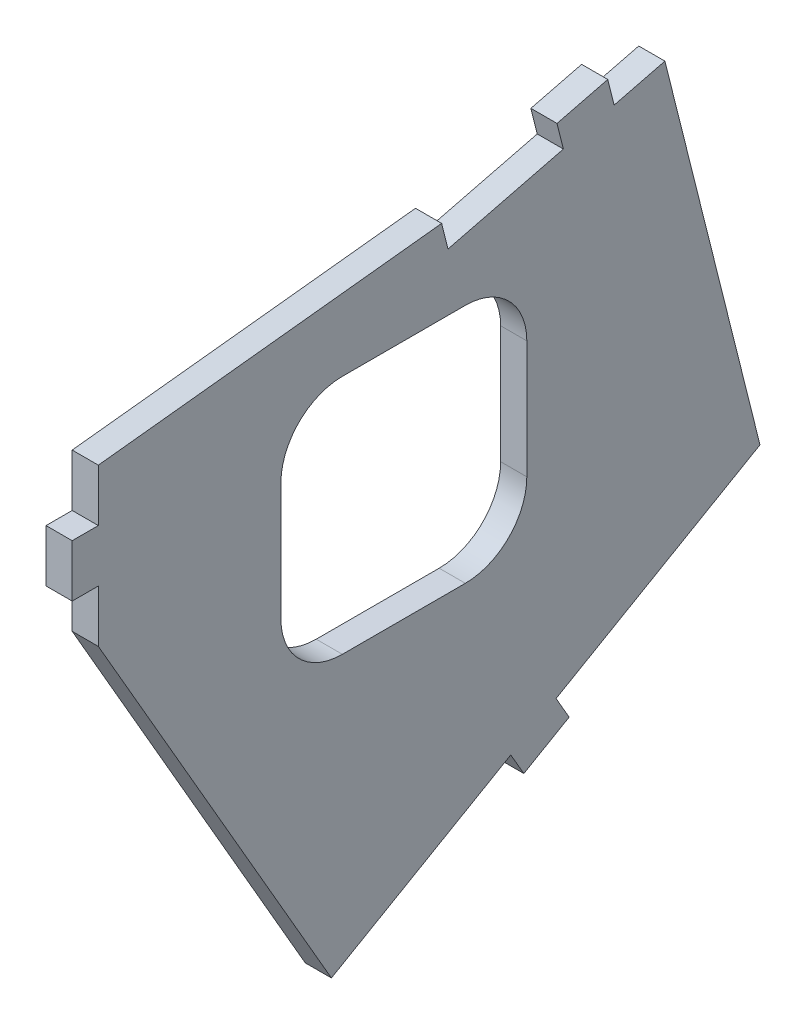
ISO-10303-21;
HEADER;
FILE_DESCRIPTION(('STEP AP214'),'2;1');
FILE_NAME('part.step','',(''),(''),'','','');
FILE_SCHEMA(('AUTOMOTIVE_DESIGN { 1 0 10303 214 1 1 1 1 }'));
ENDSEC;
DATA;
#1=APPLICATION_CONTEXT('core data for automotive mechanical design processes');
#2=APPLICATION_PROTOCOL_DEFINITION('international standard','automotive_design',2000,#1);
#3=PRODUCT_CONTEXT('',#1,'mechanical');
#4=PRODUCT('Part','Part','',(#3));
#5=PRODUCT_RELATED_PRODUCT_CATEGORY('part','',(#4));
#6=PRODUCT_DEFINITION_FORMATION('','',#4);
#7=PRODUCT_DEFINITION_CONTEXT('part definition',#1,'design');
#8=PRODUCT_DEFINITION('design','',#6,#7);
#9=PRODUCT_DEFINITION_SHAPE('','',#8);
#10=(LENGTH_UNIT() NAMED_UNIT(*) SI_UNIT(.MILLI.,.METRE.));
#11=(NAMED_UNIT(*) PLANE_ANGLE_UNIT() SI_UNIT($,.RADIAN.));
#12=(NAMED_UNIT(*) SI_UNIT($,.STERADIAN.) SOLID_ANGLE_UNIT());
#13=UNCERTAINTY_MEASURE_WITH_UNIT(LENGTH_MEASURE(1.E-05),#10,'distance_accuracy_value','');
#14=(GEOMETRIC_REPRESENTATION_CONTEXT(3) GLOBAL_UNCERTAINTY_ASSIGNED_CONTEXT((#13)) GLOBAL_UNIT_ASSIGNED_CONTEXT((#10,
#11,#12)) REPRESENTATION_CONTEXT('',''));
#15=CARTESIAN_POINT('',(0.,0.,0.));
#16=DIRECTION('',(0.,0.,1.));
#17=DIRECTION('',(1.,0.,0.));
#18=AXIS2_PLACEMENT_3D('',#15,#16,#17);
#19=CARTESIAN_POINT('',(5.,0.,0.));
#20=DIRECTION('',(-1.,0.,0.));
#21=DIRECTION('',(0.,0.,1.));
#22=AXIS2_PLACEMENT_3D('',#19,#20,#21);
#23=PLANE('',#22);
#24=DIRECTION('',(0.,-1.,0.));
#25=VECTOR('',#24,1.);
#26=CARTESIAN_POINT('',(5.,11.6246130169435,58.3876127105894));
#27=LINE('',#26,#25);
#28=CARTESIAN_POINT('',(5.,11.6246130169435,58.3876127105894));
#29=VERTEX_POINT('',#28);
#30=CARTESIAN_POINT('',(5.,1.6246130169435,58.3876127105894));
#31=VERTEX_POINT('',#30);
#32=EDGE_CURVE('E277',#29,#31,#27,.T.);
#33=ORIENTED_EDGE('',*,*,#32,.T.);
#34=DIRECTION('',(0.,-0.866025403784438,-0.5));
#35=VECTOR('',#34,1.);
#36=CARTESIAN_POINT('',(5.,-75.528183096732,13.8434251056265));
#37=LINE('',#36,#35);
#38=CARTESIAN_POINT('',(5.,-75.528183096732,13.8434251056265));
#39=VERTEX_POINT('',#38);
#40=EDGE_CURVE('E280',#31,#39,#37,.T.);
#41=ORIENTED_EDGE('',*,*,#40,.T.);
#42=DIRECTION('',(0.,0.5,-0.866025403784439));
#43=VECTOR('',#42,1.);
#44=CARTESIAN_POINT('',(5.,-55.7414224841228,-20.4282495926154));
#45=LINE('',#44,#43);
#46=CARTESIAN_POINT('',(5.,-55.7414224841228,-20.4282495926154));
#47=VERTEX_POINT('',#46);
#48=EDGE_CURVE('E283',#39,#47,#45,.T.);
#49=ORIENTED_EDGE('',*,*,#48,.T.);
#50=DIRECTION('',(0.,-0.866025403784439,-0.499999999999999));
#51=VECTOR('',#50,1.);
#52=CARTESIAN_POINT('',(5.,-55.7414224841228,-20.4282495926154));
#53=LINE('',#52,#51);
#54=CARTESIAN_POINT('',(5.,-60.071549503045,-22.9282495926154));
#55=VERTEX_POINT('',#54);
#56=EDGE_CURVE('E285',#47,#55,#53,.T.);
#57=ORIENTED_EDGE('',*,*,#56,.T.);
#58=DIRECTION('',(0.,0.5,-0.866025403784439));
#59=VECTOR('',#58,1.);
#60=CARTESIAN_POINT('',(5.,-60.071549503045,-22.9282495926154));
#61=LINE('',#60,#59);
#62=CARTESIAN_POINT('',(5.,-55.071549503045,-31.5885036304598));
#63=VERTEX_POINT('',#62);
#64=EDGE_CURVE('E287',#55,#63,#61,.T.);
#65=ORIENTED_EDGE('',*,*,#64,.T.);
#66=DIRECTION('',(0.,0.866025403784437,0.500000000000002));
#67=VECTOR('',#66,1.);
#68=CARTESIAN_POINT('',(5.,-50.7414224841228,-29.0885036304598));
#69=LINE('',#68,#67);
#70=CARTESIAN_POINT('',(5.,-50.7414224841228,-29.0885036304598));
#71=VERTEX_POINT('',#70);
#72=EDGE_CURVE('E289',#63,#71,#69,.T.);
#73=ORIENTED_EDGE('',*,*,#72,.T.);
#74=DIRECTION('',(0.,0.5,-0.866025403784439));
#75=VECTOR('',#74,1.);
#76=CARTESIAN_POINT('',(5.,-28.2414224841228,-68.0596468007595));
#77=LINE('',#76,#75);
#78=CARTESIAN_POINT('',(5.,-28.2414224841228,-68.0596468007595));
#79=VERTEX_POINT('',#78);
#80=EDGE_CURVE('E291',#71,#79,#77,.T.);
#81=ORIENTED_EDGE('',*,*,#80,.T.);
#82=DIRECTION('',(0.,0.97008009939397,0.242785091716492));
#83=VECTOR('',#82,1.);
#84=CARTESIAN_POINT('',(5.,-28.2414224841228,-68.0596468007595));
#85=LINE('',#84,#83);
#86=CARTESIAN_POINT('',(5.,44.3582653261389,-49.8898875462253));
#87=VERTEX_POINT('',#86);
#88=EDGE_CURVE('E293',#79,#87,#85,.T.);
#89=ORIENTED_EDGE('',*,*,#88,.T.);
#90=DIRECTION('',(0.,-0.242785091716491,0.97008009939397));
#91=VECTOR('',#90,1.);
#92=CARTESIAN_POINT('',(5.,41.930414408974,-40.1890865522856));
#93=LINE('',#92,#91);
#94=CARTESIAN_POINT('',(5.,41.930414408974,-40.1890865522856));
#95=VERTEX_POINT('',#94);
#96=EDGE_CURVE('E295',#87,#95,#93,.T.);
#97=ORIENTED_EDGE('',*,*,#96,.T.);
#98=DIRECTION('',(0.,0.97008009939397,0.242785091716491));
#99=VECTOR('',#98,1.);
#100=CARTESIAN_POINT('',(5.,41.930414408974,-40.1890865522856));
#101=LINE('',#100,#99);
#102=CARTESIAN_POINT('',(5.,46.7808149059438,-38.9751610937032));
#103=VERTEX_POINT('',#102);
#104=EDGE_CURVE('E297',#95,#103,#101,.T.);
#105=ORIENTED_EDGE('',*,*,#104,.T.);
#106=DIRECTION('',(0.,-0.242785091716491,0.97008009939397));
#107=VECTOR('',#106,1.);
#108=CARTESIAN_POINT('',(5.,46.7808149059438,-38.9751610937032));
#109=LINE('',#108,#107);
#110=CARTESIAN_POINT('',(5.,44.3529639887789,-29.2743600997635));
#111=VERTEX_POINT('',#110);
#112=EDGE_CURVE('E299',#103,#111,#109,.T.);
#113=ORIENTED_EDGE('',*,*,#112,.T.);
#114=DIRECTION('',(0.,-0.97008009939397,-0.242785091716491));
#115=VECTOR('',#114,1.);
#116=CARTESIAN_POINT('',(5.,39.5025634918091,-30.4882855583459));
#117=LINE('',#116,#115);
#118=CARTESIAN_POINT('',(5.,39.5025634918091,-30.4882855583459));
#119=VERTEX_POINT('',#118);
#120=EDGE_CURVE('E301',#111,#119,#117,.T.);
#121=ORIENTED_EDGE('',*,*,#120,.T.);
#122=DIRECTION('',(0.,-0.242785091716492,0.97008009939397));
#123=VECTOR('',#122,1.);
#124=CARTESIAN_POINT('',(5.,33.9840673910439,-8.43840099547162));
#125=LINE('',#124,#123);
#126=CARTESIAN_POINT('',(5.,33.9840673910439,-8.43840099547162));
#127=VERTEX_POINT('',#126);
#128=EDGE_CURVE('E303',#119,#127,#125,.T.);
#129=ORIENTED_EDGE('',*,*,#128,.T.);
#130=DIRECTION('',(0.,0.97008009939397,0.242785091716491));
#131=VECTOR('',#130,1.);
#132=CARTESIAN_POINT('',(5.,38.8344678880138,-7.22447553688917));
#133=LINE('',#132,#131);
#134=CARTESIAN_POINT('',(5.,38.8344678880138,-7.22447553688917));
#135=VERTEX_POINT('',#134);
#136=EDGE_CURVE('E305',#127,#135,#133,.T.);
#137=ORIENTED_EDGE('',*,*,#136,.T.);
#138=DIRECTION('',(0.,-0.10922858928962,0.994016657446845));
#139=VECTOR('',#138,1.);
#140=CARTESIAN_POINT('',(5.,38.8344678880138,-7.22447553688917));
#141=LINE('',#140,#139);
#142=CARTESIAN_POINT('',(5.,31.6246130169435,58.3876127105894));
#143=VERTEX_POINT('',#142);
#144=EDGE_CURVE('E307',#135,#143,#141,.T.);
#145=ORIENTED_EDGE('',*,*,#144,.T.);
#146=DIRECTION('',(0.,-1.,0.));
#147=VECTOR('',#146,1.);
#148=CARTESIAN_POINT('',(5.,31.6246130169435,58.3876127105894));
#149=LINE('',#148,#147);
#150=CARTESIAN_POINT('',(5.,21.6246130169435,58.3876127105894));
#151=VERTEX_POINT('',#150);
#152=EDGE_CURVE('E309',#143,#151,#149,.T.);
#153=ORIENTED_EDGE('',*,*,#152,.T.);
#154=DIRECTION('',(0.,0.,1.));
#155=VECTOR('',#154,1.);
#156=CARTESIAN_POINT('',(5.,21.6246130169435,58.3876127105894));
#157=LINE('',#156,#155);
#158=CARTESIAN_POINT('',(5.,21.6246130169435,63.3876127105894));
#159=VERTEX_POINT('',#158);
#160=EDGE_CURVE('E311',#151,#159,#157,.T.);
#161=ORIENTED_EDGE('',*,*,#160,.T.);
#162=DIRECTION('',(0.,-1.,0.));
#163=VECTOR('',#162,1.);
#164=CARTESIAN_POINT('',(5.,11.6246130169435,63.3876127105894));
#165=LINE('',#164,#163);
#166=CARTESIAN_POINT('',(5.,11.6246130169435,63.3876127105894));
#167=VERTEX_POINT('',#166);
#168=EDGE_CURVE('E313',#159,#167,#165,.T.);
#169=ORIENTED_EDGE('',*,*,#168,.T.);
#170=DIRECTION('',(0.,0.,-1.));
#171=VECTOR('',#170,1.);
#172=CARTESIAN_POINT('',(5.,11.6246130169435,58.3876127105894));
#173=LINE('',#172,#171);
#174=EDGE_CURVE('E315',#167,#29,#173,.T.);
#175=ORIENTED_EDGE('',*,*,#174,.T.);
#176=EDGE_LOOP('',(#33,#41,#49,#57,#65,#73,#81,#89,#97,#105,#113,#121,#129,#137,#145,#153,#161,
#169,#175));
#177=FACE_BOUND('',#176,.T.);
#178=CARTESIAN_POINT('',(5.,11.249999999999,11.75));
#179=DIRECTION('',(1.,0.,0.));
#180=DIRECTION('',(0.,0.,-1.));
#181=AXIS2_PLACEMENT_3D('',#178,#179,#180);
#182=CIRCLE('',#181,11.75);
#183=CARTESIAN_POINT('',(5.,22.999999999999,11.75));
#184=VERTEX_POINT('',#183);
#185=CARTESIAN_POINT('',(5.,11.249999999999,23.5));
#186=VERTEX_POINT('',#185);
#187=EDGE_CURVE('E212',#184,#186,#182,.T.);
#188=ORIENTED_EDGE('',*,*,#187,.F.);
#189=DIRECTION('',(0.,0.,1.));
#190=VECTOR('',#189,1.);
#191=CARTESIAN_POINT('',(5.,22.999999999999,11.75));
#192=LINE('',#191,#190);
#193=CARTESIAN_POINT('',(5.,22.999999999999,-11.75));
#194=VERTEX_POINT('',#193);
#195=EDGE_CURVE('E245',#194,#184,#192,.T.);
#196=ORIENTED_EDGE('',*,*,#195,.F.);
#197=CARTESIAN_POINT('',(5.,11.249999999999,-11.75));
#198=DIRECTION('',(1.,0.,0.));
#199=DIRECTION('',(0.,0.,1.));
#200=AXIS2_PLACEMENT_3D('',#197,#198,#199);
#201=CIRCLE('',#200,11.75);
#202=CARTESIAN_POINT('',(5.,11.249999999999,-23.5));
#203=VERTEX_POINT('',#202);
#204=EDGE_CURVE('E243',#203,#194,#201,.T.);
#205=ORIENTED_EDGE('',*,*,#204,.F.);
#206=DIRECTION('',(0.,1.,0.));
#207=VECTOR('',#206,1.);
#208=CARTESIAN_POINT('',(5.,11.249999999999,-23.5));
#209=LINE('',#208,#207);
#210=CARTESIAN_POINT('',(5.,-11.250000000001,-23.5));
#211=VERTEX_POINT('',#210);
#212=EDGE_CURVE('E241',#211,#203,#209,.T.);
#213=ORIENTED_EDGE('',*,*,#212,.F.);
#214=CARTESIAN_POINT('',(5.,-11.250000000001,-11.75));
#215=DIRECTION('',(1.,0.,0.));
#216=DIRECTION('',(0.,0.,-1.));
#217=AXIS2_PLACEMENT_3D('',#214,#215,#216);
#218=CIRCLE('',#217,11.75);
#219=CARTESIAN_POINT('',(5.,-23.000000000001,-11.75));
#220=VERTEX_POINT('',#219);
#221=EDGE_CURVE('E239',#220,#211,#218,.T.);
#222=ORIENTED_EDGE('',*,*,#221,.F.);
#223=DIRECTION('',(0.,0.,-1.));
#224=VECTOR('',#223,1.);
#225=CARTESIAN_POINT('',(5.,-23.000000000001,-11.75));
#226=LINE('',#225,#224);
#227=CARTESIAN_POINT('',(5.,-23.000000000001,11.75));
#228=VERTEX_POINT('',#227);
#229=EDGE_CURVE('E235',#228,#220,#226,.T.);
#230=ORIENTED_EDGE('',*,*,#229,.F.);
#231=CARTESIAN_POINT('',(5.,-11.250000000001,11.75));
#232=DIRECTION('',(1.,0.,0.));
#233=DIRECTION('',(0.,0.,1.));
#234=AXIS2_PLACEMENT_3D('',#231,#232,#233);
#235=CIRCLE('',#234,11.75);
#236=CARTESIAN_POINT('',(5.,-11.250000000001,23.5));
#237=VERTEX_POINT('',#236);
#238=EDGE_CURVE('E233',#237,#228,#235,.T.);
#239=ORIENTED_EDGE('',*,*,#238,.F.);
#240=DIRECTION('',(0.,-1.,0.));
#241=VECTOR('',#240,1.);
#242=CARTESIAN_POINT('',(5.,-11.250000000001,23.5));
#243=LINE('',#242,#241);
#244=EDGE_CURVE('E220',#186,#237,#243,.T.);
#245=ORIENTED_EDGE('',*,*,#244,.F.);
#246=EDGE_LOOP('',(#188,#196,#205,#213,#222,#230,#239,#245));
#247=FACE_BOUND('',#246,.T.);
#248=ADVANCED_FACE('F33',(#177,#247),#23,.F.);
#249=CARTESIAN_POINT('',(0.,0.,0.));
#250=DIRECTION('',(-1.,0.,0.));
#251=DIRECTION('',(0.,0.,1.));
#252=AXIS2_PLACEMENT_3D('',#249,#250,#251);
#253=PLANE('',#252);
#254=DIRECTION('',(0.,-1.,0.));
#255=VECTOR('',#254,1.);
#256=CARTESIAN_POINT('',(0.,11.6246130169435,58.3876127105894));
#257=LINE('',#256,#255);
#258=CARTESIAN_POINT('',(0.,11.6246130169435,58.3876127105894));
#259=VERTEX_POINT('',#258);
#260=CARTESIAN_POINT('',(0.,1.6246130169435,58.3876127105894));
#261=VERTEX_POINT('',#260);
#262=EDGE_CURVE('E228',#259,#261,#257,.T.);
#263=ORIENTED_EDGE('',*,*,#262,.F.);
#264=DIRECTION('',(0.,0.,-1.));
#265=VECTOR('',#264,1.);
#266=CARTESIAN_POINT('',(0.,11.6246130169435,58.3876127105894));
#267=LINE('',#266,#265);
#268=CARTESIAN_POINT('',(0.,11.6246130169435,63.3876127105894));
#269=VERTEX_POINT('',#268);
#270=EDGE_CURVE('E281',#269,#259,#267,.T.);
#271=ORIENTED_EDGE('',*,*,#270,.F.);
#272=DIRECTION('',(0.,-1.,0.));
#273=VECTOR('',#272,1.);
#274=CARTESIAN_POINT('',(0.,11.6246130169435,63.3876127105894));
#275=LINE('',#274,#273);
#276=CARTESIAN_POINT('',(0.,21.6246130169435,63.3876127105894));
#277=VERTEX_POINT('',#276);
#278=EDGE_CURVE('E352',#277,#269,#275,.T.);
#279=ORIENTED_EDGE('',*,*,#278,.F.);
#280=DIRECTION('',(0.,0.,1.));
#281=VECTOR('',#280,1.);
#282=CARTESIAN_POINT('',(0.,21.6246130169435,58.3876127105894));
#283=LINE('',#282,#281);
#284=CARTESIAN_POINT('',(0.,21.6246130169435,58.3876127105894));
#285=VERTEX_POINT('',#284);
#286=EDGE_CURVE('E350',#285,#277,#283,.T.);
#287=ORIENTED_EDGE('',*,*,#286,.F.);
#288=DIRECTION('',(0.,-1.,0.));
#289=VECTOR('',#288,1.);
#290=CARTESIAN_POINT('',(0.,31.6246130169435,58.3876127105894));
#291=LINE('',#290,#289);
#292=CARTESIAN_POINT('',(0.,31.6246130169435,58.3876127105894));
#293=VERTEX_POINT('',#292);
#294=EDGE_CURVE('E348',#293,#285,#291,.T.);
#295=ORIENTED_EDGE('',*,*,#294,.F.);
#296=DIRECTION('',(0.,-0.10922858928962,0.994016657446845));
#297=VECTOR('',#296,1.);
#298=CARTESIAN_POINT('',(0.,38.8344678880138,-7.22447553688917));
#299=LINE('',#298,#297);
#300=CARTESIAN_POINT('',(0.,38.8344678880138,-7.22447553688917));
#301=VERTEX_POINT('',#300);
#302=EDGE_CURVE('E346',#301,#293,#299,.T.);
#303=ORIENTED_EDGE('',*,*,#302,.F.);
#304=DIRECTION('',(0.,0.97008009939397,0.242785091716491));
#305=VECTOR('',#304,1.);
#306=CARTESIAN_POINT('',(0.,38.8344678880138,-7.22447553688917));
#307=LINE('',#306,#305);
#308=CARTESIAN_POINT('',(0.,33.9840673910439,-8.43840099547162));
#309=VERTEX_POINT('',#308);
#310=EDGE_CURVE('E344',#309,#301,#307,.T.);
#311=ORIENTED_EDGE('',*,*,#310,.F.);
#312=DIRECTION('',(0.,-0.242785091716492,0.97008009939397));
#313=VECTOR('',#312,1.);
#314=CARTESIAN_POINT('',(0.,33.9840673910439,-8.43840099547162));
#315=LINE('',#314,#313);
#316=CARTESIAN_POINT('',(0.,39.5025634918091,-30.4882855583459));
#317=VERTEX_POINT('',#316);
#318=EDGE_CURVE('E342',#317,#309,#315,.T.);
#319=ORIENTED_EDGE('',*,*,#318,.F.);
#320=DIRECTION('',(0.,-0.97008009939397,-0.242785091716491));
#321=VECTOR('',#320,1.);
#322=CARTESIAN_POINT('',(0.,39.5025634918091,-30.4882855583459));
#323=LINE('',#322,#321);
#324=CARTESIAN_POINT('',(0.,44.3529639887789,-29.2743600997635));
#325=VERTEX_POINT('',#324);
#326=EDGE_CURVE('E340',#325,#317,#323,.T.);
#327=ORIENTED_EDGE('',*,*,#326,.F.);
#328=DIRECTION('',(0.,-0.242785091716491,0.97008009939397));
#329=VECTOR('',#328,1.);
#330=CARTESIAN_POINT('',(0.,46.7808149059438,-38.9751610937032));
#331=LINE('',#330,#329);
#332=CARTESIAN_POINT('',(0.,46.7808149059438,-38.9751610937032));
#333=VERTEX_POINT('',#332);
#334=EDGE_CURVE('E338',#333,#325,#331,.T.);
#335=ORIENTED_EDGE('',*,*,#334,.F.);
#336=DIRECTION('',(0.,0.97008009939397,0.242785091716491));
#337=VECTOR('',#336,1.);
#338=CARTESIAN_POINT('',(0.,41.930414408974,-40.1890865522856));
#339=LINE('',#338,#337);
#340=CARTESIAN_POINT('',(0.,41.930414408974,-40.1890865522856));
#341=VERTEX_POINT('',#340);
#342=EDGE_CURVE('E336',#341,#333,#339,.T.);
#343=ORIENTED_EDGE('',*,*,#342,.F.);
#344=DIRECTION('',(0.,-0.242785091716491,0.97008009939397));
#345=VECTOR('',#344,1.);
#346=CARTESIAN_POINT('',(0.,41.930414408974,-40.1890865522856));
#347=LINE('',#346,#345);
#348=CARTESIAN_POINT('',(0.,44.3582653261389,-49.8898875462253));
#349=VERTEX_POINT('',#348);
#350=EDGE_CURVE('E334',#349,#341,#347,.T.);
#351=ORIENTED_EDGE('',*,*,#350,.F.);
#352=DIRECTION('',(0.,0.97008009939397,0.242785091716492));
#353=VECTOR('',#352,1.);
#354=CARTESIAN_POINT('',(0.,-28.2414224841228,-68.0596468007595));
#355=LINE('',#354,#353);
#356=CARTESIAN_POINT('',(0.,-28.2414224841228,-68.0596468007595));
#357=VERTEX_POINT('',#356);
#358=EDGE_CURVE('E332',#357,#349,#355,.T.);
#359=ORIENTED_EDGE('',*,*,#358,.F.);
#360=DIRECTION('',(0.,0.5,-0.866025403784439));
#361=VECTOR('',#360,1.);
#362=CARTESIAN_POINT('',(0.,-28.2414224841228,-68.0596468007595));
#363=LINE('',#362,#361);
#364=CARTESIAN_POINT('',(0.,-50.7414224841228,-29.0885036304598));
#365=VERTEX_POINT('',#364);
#366=EDGE_CURVE('E330',#365,#357,#363,.T.);
#367=ORIENTED_EDGE('',*,*,#366,.F.);
#368=DIRECTION('',(0.,0.866025403784437,0.500000000000002));
#369=VECTOR('',#368,1.);
#370=CARTESIAN_POINT('',(0.,-50.7414224841228,-29.0885036304598));
#371=LINE('',#370,#369);
#372=CARTESIAN_POINT('',(0.,-55.071549503045,-31.5885036304598));
#373=VERTEX_POINT('',#372);
#374=EDGE_CURVE('E328',#373,#365,#371,.T.);
#375=ORIENTED_EDGE('',*,*,#374,.F.);
#376=DIRECTION('',(0.,0.5,-0.866025403784439));
#377=VECTOR('',#376,1.);
#378=CARTESIAN_POINT('',(0.,-60.071549503045,-22.9282495926154));
#379=LINE('',#378,#377);
#380=CARTESIAN_POINT('',(0.,-60.071549503045,-22.9282495926154));
#381=VERTEX_POINT('',#380);
#382=EDGE_CURVE('E326',#381,#373,#379,.T.);
#383=ORIENTED_EDGE('',*,*,#382,.F.);
#384=DIRECTION('',(0.,-0.866025403784439,-0.499999999999999));
#385=VECTOR('',#384,1.);
#386=CARTESIAN_POINT('',(0.,-55.7414224841228,-20.4282495926154));
#387=LINE('',#386,#385);
#388=CARTESIAN_POINT('',(0.,-55.7414224841228,-20.4282495926154));
#389=VERTEX_POINT('',#388);
#390=EDGE_CURVE('E324',#389,#381,#387,.T.);
#391=ORIENTED_EDGE('',*,*,#390,.F.);
#392=DIRECTION('',(0.,0.5,-0.866025403784439));
#393=VECTOR('',#392,1.);
#394=CARTESIAN_POINT('',(0.,-55.7414224841228,-20.4282495926154));
#395=LINE('',#394,#393);
#396=CARTESIAN_POINT('',(0.,-75.528183096732,13.8434251056265));
#397=VERTEX_POINT('',#396);
#398=EDGE_CURVE('E322',#397,#389,#395,.T.);
#399=ORIENTED_EDGE('',*,*,#398,.F.);
#400=DIRECTION('',(0.,-0.866025403784438,-0.5));
#401=VECTOR('',#400,1.);
#402=CARTESIAN_POINT('',(0.,-75.528183096732,13.8434251056265));
#403=LINE('',#402,#401);
#404=EDGE_CURVE('E320',#261,#397,#403,.T.);
#405=ORIENTED_EDGE('',*,*,#404,.F.);
#406=EDGE_LOOP('',(#263,#271,#279,#287,#295,#303,#311,#319,#327,#335,#343,#351,#359,#367,#375,
#383,#391,#399,#405));
#407=FACE_BOUND('',#406,.T.);
#408=DIRECTION('',(0.,0.,1.));
#409=VECTOR('',#408,1.);
#410=CARTESIAN_POINT('',(0.,22.999999999999,11.75));
#411=LINE('',#410,#409);
#412=CARTESIAN_POINT('',(0.,22.999999999999,-11.75));
#413=VERTEX_POINT('',#412);
#414=CARTESIAN_POINT('',(0.,22.999999999999,11.75));
#415=VERTEX_POINT('',#414);
#416=EDGE_CURVE('E221',#413,#415,#411,.T.);
#417=ORIENTED_EDGE('',*,*,#416,.T.);
#418=CARTESIAN_POINT('',(0.,11.249999999999,11.75));
#419=DIRECTION('',(1.,0.,0.));
#420=DIRECTION('',(0.,0.,-1.));
#421=AXIS2_PLACEMENT_3D('',#418,#419,#420);
#422=CIRCLE('',#421,11.75);
#423=CARTESIAN_POINT('',(0.,11.249999999999,23.5));
#424=VERTEX_POINT('',#423);
#425=EDGE_CURVE('E56',#415,#424,#422,.T.);
#426=ORIENTED_EDGE('',*,*,#425,.T.);
#427=DIRECTION('',(0.,-1.,0.));
#428=VECTOR('',#427,1.);
#429=CARTESIAN_POINT('',(0.,-11.250000000001,23.5));
#430=LINE('',#429,#428);
#431=CARTESIAN_POINT('',(0.,-11.250000000001,23.5));
#432=VERTEX_POINT('',#431);
#433=EDGE_CURVE('E227',#424,#432,#430,.T.);
#434=ORIENTED_EDGE('',*,*,#433,.T.);
#435=CARTESIAN_POINT('',(0.,-11.250000000001,11.75));
#436=DIRECTION('',(1.,0.,0.));
#437=DIRECTION('',(0.,0.,1.));
#438=AXIS2_PLACEMENT_3D('',#435,#436,#437);
#439=CIRCLE('',#438,11.75);
#440=CARTESIAN_POINT('',(0.,-23.000000000001,11.75));
#441=VERTEX_POINT('',#440);
#442=EDGE_CURVE('E249',#432,#441,#439,.T.);
#443=ORIENTED_EDGE('',*,*,#442,.T.);
#444=DIRECTION('',(0.,0.,-1.));
#445=VECTOR('',#444,1.);
#446=CARTESIAN_POINT('',(0.,-23.000000000001,-11.75));
#447=LINE('',#446,#445);
#448=CARTESIAN_POINT('',(0.,-23.000000000001,-11.75));
#449=VERTEX_POINT('',#448);
#450=EDGE_CURVE('E252',#441,#449,#447,.T.);
#451=ORIENTED_EDGE('',*,*,#450,.T.);
#452=CARTESIAN_POINT('',(0.,-11.250000000001,-11.75));
#453=DIRECTION('',(1.,0.,0.));
#454=DIRECTION('',(0.,0.,-1.));
#455=AXIS2_PLACEMENT_3D('',#452,#453,#454);
#456=CIRCLE('',#455,11.75);
#457=CARTESIAN_POINT('',(0.,-11.250000000001,-23.5));
#458=VERTEX_POINT('',#457);
#459=EDGE_CURVE('E255',#449,#458,#456,.T.);
#460=ORIENTED_EDGE('',*,*,#459,.T.);
#461=DIRECTION('',(0.,1.,0.));
#462=VECTOR('',#461,1.);
#463=CARTESIAN_POINT('',(0.,11.249999999999,-23.5));
#464=LINE('',#463,#462);
#465=CARTESIAN_POINT('',(0.,11.249999999999,-23.5));
#466=VERTEX_POINT('',#465);
#467=EDGE_CURVE('E258',#458,#466,#464,.T.);
#468=ORIENTED_EDGE('',*,*,#467,.T.);
#469=CARTESIAN_POINT('',(0.,11.249999999999,-11.75));
#470=DIRECTION('',(1.,0.,0.));
#471=DIRECTION('',(0.,0.,1.));
#472=AXIS2_PLACEMENT_3D('',#469,#470,#471);
#473=CIRCLE('',#472,11.75);
#474=EDGE_CURVE('E261',#466,#413,#473,.T.);
#475=ORIENTED_EDGE('',*,*,#474,.T.);
#476=EDGE_LOOP('',(#417,#426,#434,#443,#451,#460,#468,#475));
#477=FACE_BOUND('',#476,.T.);
#478=ADVANCED_FACE('F415',(#407,#477),#253,.T.);
#479=CARTESIAN_POINT('',(5.,11.6246130169435,58.3876127105894));
#480=DIRECTION('',(0.,0.,-1.));
#481=DIRECTION('',(-1.,0.,0.));
#482=AXIS2_PLACEMENT_3D('',#479,#480,#481);
#483=PLANE('',#482);
#484=ORIENTED_EDGE('',*,*,#262,.T.);
#485=DIRECTION('',(-1.,0.,0.));
#486=VECTOR('',#485,1.);
#487=CARTESIAN_POINT('',(5.,1.6246130169435,58.3876127105894));
#488=LINE('',#487,#486);
#489=EDGE_CURVE('E11',#31,#261,#488,.T.);
#490=ORIENTED_EDGE('',*,*,#489,.F.);
#491=ORIENTED_EDGE('',*,*,#32,.F.);
#492=DIRECTION('',(-1.,0.,0.));
#493=VECTOR('',#492,1.);
#494=CARTESIAN_POINT('',(5.,11.6246130169435,58.3876127105894));
#495=LINE('',#494,#493);
#496=EDGE_CURVE('E317',#29,#259,#495,.T.);
#497=ORIENTED_EDGE('',*,*,#496,.T.);
#498=EDGE_LOOP('',(#484,#490,#491,#497));
#499=FACE_BOUND('',#498,.T.);
#500=ADVANCED_FACE('F35',(#499),#483,.F.);
#501=CARTESIAN_POINT('',(5.,-75.528183096732,13.8434251056265));
#502=DIRECTION('',(0.,0.5,-0.866025403784438));
#503=DIRECTION('',(0.,0.866025403784439,0.5));
#504=AXIS2_PLACEMENT_3D('',#501,#502,#503);
#505=PLANE('',#504);
#506=ORIENTED_EDGE('',*,*,#404,.T.);
#507=DIRECTION('',(-1.,0.,0.));
#508=VECTOR('',#507,1.);
#509=CARTESIAN_POINT('',(5.,-75.528183096732,13.8434251056265));
#510=LINE('',#509,#508);
#511=EDGE_CURVE('E41',#39,#397,#510,.T.);
#512=ORIENTED_EDGE('',*,*,#511,.F.);
#513=ORIENTED_EDGE('',*,*,#40,.F.);
#514=ORIENTED_EDGE('',*,*,#489,.T.);
#515=EDGE_LOOP('',(#506,#512,#513,#514));
#516=FACE_BOUND('',#515,.T.);
#517=ADVANCED_FACE('F432',(#516),#505,.F.);
#518=CARTESIAN_POINT('',(5.,-55.7414224841228,-20.4282495926154));
#519=DIRECTION('',(0.,0.866025403784439,0.5));
#520=DIRECTION('',(0.,-0.5,0.866025403784439));
#521=AXIS2_PLACEMENT_3D('',#518,#519,#520);
#522=PLANE('',#521);
#523=ORIENTED_EDGE('',*,*,#398,.T.);
#524=DIRECTION('',(-1.,0.,0.));
#525=VECTOR('',#524,1.);
#526=CARTESIAN_POINT('',(5.,-55.7414224841228,-20.4282495926154));
#527=LINE('',#526,#525);
#528=EDGE_CURVE('E402',#47,#389,#527,.T.);
#529=ORIENTED_EDGE('',*,*,#528,.F.);
#530=ORIENTED_EDGE('',*,*,#48,.F.);
#531=ORIENTED_EDGE('',*,*,#511,.T.);
#532=EDGE_LOOP('',(#523,#529,#530,#531));
#533=FACE_BOUND('',#532,.T.);
#534=ADVANCED_FACE('F409',(#533),#522,.F.);
#535=CARTESIAN_POINT('',(5.,-55.7414224841228,-20.4282495926154));
#536=DIRECTION('',(0.,0.499999999999999,-0.866025403784439));
#537=DIRECTION('',(0.,0.866025403784439,0.499999999999999));
#538=AXIS2_PLACEMENT_3D('',#535,#536,#537);
#539=PLANE('',#538);
#540=ORIENTED_EDGE('',*,*,#390,.T.);
#541=DIRECTION('',(-1.,0.,0.));
#542=VECTOR('',#541,1.);
#543=CARTESIAN_POINT('',(5.,-60.071549503045,-22.9282495926154));
#544=LINE('',#543,#542);
#545=EDGE_CURVE('E399',#55,#381,#544,.T.);
#546=ORIENTED_EDGE('',*,*,#545,.F.);
#547=ORIENTED_EDGE('',*,*,#56,.F.);
#548=ORIENTED_EDGE('',*,*,#528,.T.);
#549=EDGE_LOOP('',(#540,#546,#547,#548));
#550=FACE_BOUND('',#549,.T.);
#551=ADVANCED_FACE('F421',(#550),#539,.F.);
#552=CARTESIAN_POINT('',(5.,-60.071549503045,-22.9282495926154));
#553=DIRECTION('',(0.,0.866025403784439,0.5));
#554=DIRECTION('',(0.,-0.5,0.866025403784439));
#555=AXIS2_PLACEMENT_3D('',#552,#553,#554);
#556=PLANE('',#555);
#557=ORIENTED_EDGE('',*,*,#382,.T.);
#558=DIRECTION('',(-1.,0.,0.));
#559=VECTOR('',#558,1.);
#560=CARTESIAN_POINT('',(5.,-55.071549503045,-31.5885036304598));
#561=LINE('',#560,#559);
#562=EDGE_CURVE('E396',#63,#373,#561,.T.);
#563=ORIENTED_EDGE('',*,*,#562,.F.);
#564=ORIENTED_EDGE('',*,*,#64,.F.);
#565=ORIENTED_EDGE('',*,*,#545,.T.);
#566=EDGE_LOOP('',(#557,#563,#564,#565));
#567=FACE_BOUND('',#566,.T.);
#568=ADVANCED_FACE('F425',(#567),#556,.F.);
#569=CARTESIAN_POINT('',(5.,-50.7414224841228,-29.0885036304598));
#570=DIRECTION('',(0.,-0.500000000000002,0.866025403784437));
#571=DIRECTION('',(0.,-0.866025403784437,-0.500000000000002));
#572=AXIS2_PLACEMENT_3D('',#569,#570,#571);
#573=PLANE('',#572);
#574=ORIENTED_EDGE('',*,*,#374,.T.);
#575=DIRECTION('',(-1.,0.,0.));
#576=VECTOR('',#575,1.);
#577=CARTESIAN_POINT('',(5.,-50.7414224841228,-29.0885036304598));
#578=LINE('',#577,#576);
#579=EDGE_CURVE('E393',#71,#365,#578,.T.);
#580=ORIENTED_EDGE('',*,*,#579,.F.);
#581=ORIENTED_EDGE('',*,*,#72,.F.);
#582=ORIENTED_EDGE('',*,*,#562,.T.);
#583=EDGE_LOOP('',(#574,#580,#581,#582));
#584=FACE_BOUND('',#583,.T.);
#585=ADVANCED_FACE('F500',(#584),#573,.F.);
#586=CARTESIAN_POINT('',(5.,-28.2414224841228,-68.0596468007595));
#587=DIRECTION('',(0.,0.866025403784439,0.5));
#588=DIRECTION('',(0.,-0.5,0.866025403784439));
#589=AXIS2_PLACEMENT_3D('',#586,#587,#588);
#590=PLANE('',#589);
#591=ORIENTED_EDGE('',*,*,#366,.T.);
#592=DIRECTION('',(-1.,0.,0.));
#593=VECTOR('',#592,1.);
#594=CARTESIAN_POINT('',(5.,-28.2414224841228,-68.0596468007595));
#595=LINE('',#594,#593);
#596=EDGE_CURVE('E390',#79,#357,#595,.T.);
#597=ORIENTED_EDGE('',*,*,#596,.F.);
#598=ORIENTED_EDGE('',*,*,#80,.F.);
#599=ORIENTED_EDGE('',*,*,#579,.T.);
#600=EDGE_LOOP('',(#591,#597,#598,#599));
#601=FACE_BOUND('',#600,.T.);
#602=ADVANCED_FACE('F497',(#601),#590,.F.);
#603=CARTESIAN_POINT('',(5.,-28.2414224841228,-68.0596468007595));
#604=DIRECTION('',(0.,-0.242785091716492,0.97008009939397));
#605=DIRECTION('',(0.,-0.97008009939397,-0.242785091716492));
#606=AXIS2_PLACEMENT_3D('',#603,#604,#605);
#607=PLANE('',#606);
#608=ORIENTED_EDGE('',*,*,#358,.T.);
#609=DIRECTION('',(-1.,0.,0.));
#610=VECTOR('',#609,1.);
#611=CARTESIAN_POINT('',(5.,44.3582653261389,-49.8898875462253));
#612=LINE('',#611,#610);
#613=EDGE_CURVE('E387',#87,#349,#612,.T.);
#614=ORIENTED_EDGE('',*,*,#613,.F.);
#615=ORIENTED_EDGE('',*,*,#88,.F.);
#616=ORIENTED_EDGE('',*,*,#596,.T.);
#617=EDGE_LOOP('',(#608,#614,#615,#616));
#618=FACE_BOUND('',#617,.T.);
#619=ADVANCED_FACE('F493',(#618),#607,.F.);
#620=CARTESIAN_POINT('',(5.,41.930414408974,-40.1890865522856));
#621=DIRECTION('',(0.,-0.97008009939397,-0.242785091716491));
#622=DIRECTION('',(0.,0.242785091716491,-0.97008009939397));
#623=AXIS2_PLACEMENT_3D('',#620,#621,#622);
#624=PLANE('',#623);
#625=ORIENTED_EDGE('',*,*,#350,.T.);
#626=DIRECTION('',(-1.,0.,0.));
#627=VECTOR('',#626,1.);
#628=CARTESIAN_POINT('',(5.,41.930414408974,-40.1890865522856));
#629=LINE('',#628,#627);
#630=EDGE_CURVE('E384',#95,#341,#629,.T.);
#631=ORIENTED_EDGE('',*,*,#630,.F.);
#632=ORIENTED_EDGE('',*,*,#96,.F.);
#633=ORIENTED_EDGE('',*,*,#613,.T.);
#634=EDGE_LOOP('',(#625,#631,#632,#633));
#635=FACE_BOUND('',#634,.T.);
#636=ADVANCED_FACE('F489',(#635),#624,.F.);
#637=CARTESIAN_POINT('',(5.,41.930414408974,-40.1890865522856));
#638=DIRECTION('',(0.,-0.242785091716491,0.97008009939397));
#639=DIRECTION('',(0.,-0.97008009939397,-0.242785091716491));
#640=AXIS2_PLACEMENT_3D('',#637,#638,#639);
#641=PLANE('',#640);
#642=ORIENTED_EDGE('',*,*,#342,.T.);
#643=DIRECTION('',(-1.,0.,0.));
#644=VECTOR('',#643,1.);
#645=CARTESIAN_POINT('',(5.,46.7808149059438,-38.9751610937032));
#646=LINE('',#645,#644);
#647=EDGE_CURVE('E381',#103,#333,#646,.T.);
#648=ORIENTED_EDGE('',*,*,#647,.F.);
#649=ORIENTED_EDGE('',*,*,#104,.F.);
#650=ORIENTED_EDGE('',*,*,#630,.T.);
#651=EDGE_LOOP('',(#642,#648,#649,#650));
#652=FACE_BOUND('',#651,.T.);
#653=ADVANCED_FACE('F484',(#652),#641,.F.);
#654=CARTESIAN_POINT('',(5.,46.7808149059438,-38.9751610937032));
#655=DIRECTION('',(0.,-0.97008009939397,-0.242785091716491));
#656=DIRECTION('',(0.,0.242785091716491,-0.97008009939397));
#657=AXIS2_PLACEMENT_3D('',#654,#655,#656);
#658=PLANE('',#657);
#659=ORIENTED_EDGE('',*,*,#334,.T.);
#660=DIRECTION('',(-1.,0.,0.));
#661=VECTOR('',#660,1.);
#662=CARTESIAN_POINT('',(5.,44.3529639887789,-29.2743600997635));
#663=LINE('',#662,#661);
#664=EDGE_CURVE('E378',#111,#325,#663,.T.);
#665=ORIENTED_EDGE('',*,*,#664,.F.);
#666=ORIENTED_EDGE('',*,*,#112,.F.);
#667=ORIENTED_EDGE('',*,*,#647,.T.);
#668=EDGE_LOOP('',(#659,#665,#666,#667));
#669=FACE_BOUND('',#668,.T.);
#670=ADVANCED_FACE('F478',(#669),#658,.F.);
#671=CARTESIAN_POINT('',(5.,39.5025634918091,-30.4882855583459));
#672=DIRECTION('',(0.,0.242785091716491,-0.97008009939397));
#673=DIRECTION('',(0.,0.97008009939397,0.242785091716492));
#674=AXIS2_PLACEMENT_3D('',#671,#672,#673);
#675=PLANE('',#674);
#676=ORIENTED_EDGE('',*,*,#326,.T.);
#677=DIRECTION('',(-1.,0.,0.));
#678=VECTOR('',#677,1.);
#679=CARTESIAN_POINT('',(5.,39.5025634918091,-30.4882855583459));
#680=LINE('',#679,#678);
#681=EDGE_CURVE('E375',#119,#317,#680,.T.);
#682=ORIENTED_EDGE('',*,*,#681,.F.);
#683=ORIENTED_EDGE('',*,*,#120,.F.);
#684=ORIENTED_EDGE('',*,*,#664,.T.);
#685=EDGE_LOOP('',(#676,#682,#683,#684));
#686=FACE_BOUND('',#685,.T.);
#687=ADVANCED_FACE('F474',(#686),#675,.F.);
#688=CARTESIAN_POINT('',(5.,33.9840673910439,-8.43840099547162));
#689=DIRECTION('',(0.,-0.97008009939397,-0.242785091716492));
#690=DIRECTION('',(0.,0.242785091716492,-0.97008009939397));
#691=AXIS2_PLACEMENT_3D('',#688,#689,#690);
#692=PLANE('',#691);
#693=ORIENTED_EDGE('',*,*,#318,.T.);
#694=DIRECTION('',(-1.,0.,0.));
#695=VECTOR('',#694,1.);
#696=CARTESIAN_POINT('',(5.,33.9840673910439,-8.43840099547162));
#697=LINE('',#696,#695);
#698=EDGE_CURVE('E372',#127,#309,#697,.T.);
#699=ORIENTED_EDGE('',*,*,#698,.F.);
#700=ORIENTED_EDGE('',*,*,#128,.F.);
#701=ORIENTED_EDGE('',*,*,#681,.T.);
#702=EDGE_LOOP('',(#693,#699,#700,#701));
#703=FACE_BOUND('',#702,.T.);
#704=ADVANCED_FACE('F469',(#703),#692,.F.);
#705=CARTESIAN_POINT('',(5.,38.8344678880138,-7.22447553688917));
#706=DIRECTION('',(0.,-0.242785091716491,0.97008009939397));
#707=DIRECTION('',(0.,-0.97008009939397,-0.242785091716491));
#708=AXIS2_PLACEMENT_3D('',#705,#706,#707);
#709=PLANE('',#708);
#710=ORIENTED_EDGE('',*,*,#310,.T.);
#711=DIRECTION('',(-1.,0.,0.));
#712=VECTOR('',#711,1.);
#713=CARTESIAN_POINT('',(5.,38.8344678880138,-7.22447553688917));
#714=LINE('',#713,#712);
#715=EDGE_CURVE('E369',#135,#301,#714,.T.);
#716=ORIENTED_EDGE('',*,*,#715,.F.);
#717=ORIENTED_EDGE('',*,*,#136,.F.);
#718=ORIENTED_EDGE('',*,*,#698,.T.);
#719=EDGE_LOOP('',(#710,#716,#717,#718));
#720=FACE_BOUND('',#719,.T.);
#721=ADVANCED_FACE('F463',(#720),#709,.F.);
#722=CARTESIAN_POINT('',(5.,38.8344678880138,-7.22447553688917));
#723=DIRECTION('',(0.,-0.994016657446846,-0.10922858928962));
#724=DIRECTION('',(0.,0.10922858928962,-0.994016657446846));
#725=AXIS2_PLACEMENT_3D('',#722,#723,#724);
#726=PLANE('',#725);
#727=ORIENTED_EDGE('',*,*,#302,.T.);
#728=DIRECTION('',(-1.,0.,0.));
#729=VECTOR('',#728,1.);
#730=CARTESIAN_POINT('',(5.,31.6246130169435,58.3876127105894));
#731=LINE('',#730,#729);
#732=EDGE_CURVE('E366',#143,#293,#731,.T.);
#733=ORIENTED_EDGE('',*,*,#732,.F.);
#734=ORIENTED_EDGE('',*,*,#144,.F.);
#735=ORIENTED_EDGE('',*,*,#715,.T.);
#736=EDGE_LOOP('',(#727,#733,#734,#735));
#737=FACE_BOUND('',#736,.T.);
#738=ADVANCED_FACE('F459',(#737),#726,.F.);
#739=CARTESIAN_POINT('',(5.,31.6246130169435,58.3876127105894));
#740=DIRECTION('',(0.,0.,-1.));
#741=DIRECTION('',(-1.,0.,0.));
#742=AXIS2_PLACEMENT_3D('',#739,#740,#741);
#743=PLANE('',#742);
#744=ORIENTED_EDGE('',*,*,#294,.T.);
#745=DIRECTION('',(-1.,0.,0.));
#746=VECTOR('',#745,1.);
#747=CARTESIAN_POINT('',(5.,21.6246130169435,58.3876127105894));
#748=LINE('',#747,#746);
#749=EDGE_CURVE('E363',#151,#285,#748,.T.);
#750=ORIENTED_EDGE('',*,*,#749,.F.);
#751=ORIENTED_EDGE('',*,*,#152,.F.);
#752=ORIENTED_EDGE('',*,*,#732,.T.);
#753=EDGE_LOOP('',(#744,#750,#751,#752));
#754=FACE_BOUND('',#753,.T.);
#755=ADVANCED_FACE('F454',(#754),#743,.F.);
#756=CARTESIAN_POINT('',(5.,21.6246130169435,58.3876127105894));
#757=DIRECTION('',(0.,-1.,0.));
#758=DIRECTION('',(0.,0.,-1.));
#759=AXIS2_PLACEMENT_3D('',#756,#757,#758);
#760=PLANE('',#759);
#761=ORIENTED_EDGE('',*,*,#286,.T.);
#762=DIRECTION('',(-1.,0.,0.));
#763=VECTOR('',#762,1.);
#764=CARTESIAN_POINT('',(5.,21.6246130169435,63.3876127105894));
#765=LINE('',#764,#763);
#766=EDGE_CURVE('E360',#159,#277,#765,.T.);
#767=ORIENTED_EDGE('',*,*,#766,.F.);
#768=ORIENTED_EDGE('',*,*,#160,.F.);
#769=ORIENTED_EDGE('',*,*,#749,.T.);
#770=EDGE_LOOP('',(#761,#767,#768,#769));
#771=FACE_BOUND('',#770,.T.);
#772=ADVANCED_FACE('F448',(#771),#760,.F.);
#773=CARTESIAN_POINT('',(5.,11.6246130169435,63.3876127105894));
#774=DIRECTION('',(0.,0.,-1.));
#775=DIRECTION('',(-1.,0.,0.));
#776=AXIS2_PLACEMENT_3D('',#773,#774,#775);
#777=PLANE('',#776);
#778=ORIENTED_EDGE('',*,*,#278,.T.);
#779=DIRECTION('',(-1.,0.,0.));
#780=VECTOR('',#779,1.);
#781=CARTESIAN_POINT('',(5.,11.6246130169435,63.3876127105894));
#782=LINE('',#781,#780);
#783=EDGE_CURVE('E357',#167,#269,#782,.T.);
#784=ORIENTED_EDGE('',*,*,#783,.F.);
#785=ORIENTED_EDGE('',*,*,#168,.F.);
#786=ORIENTED_EDGE('',*,*,#766,.T.);
#787=EDGE_LOOP('',(#778,#784,#785,#786));
#788=FACE_BOUND('',#787,.T.);
#789=ADVANCED_FACE('F444',(#788),#777,.F.);
#790=CARTESIAN_POINT('',(5.,11.6246130169435,58.3876127105894));
#791=DIRECTION('',(0.,1.,0.));
#792=DIRECTION('',(0.,0.,1.));
#793=AXIS2_PLACEMENT_3D('',#790,#791,#792);
#794=PLANE('',#793);
#795=ORIENTED_EDGE('',*,*,#270,.T.);
#796=ORIENTED_EDGE('',*,*,#496,.F.);
#797=ORIENTED_EDGE('',*,*,#174,.F.);
#798=ORIENTED_EDGE('',*,*,#783,.T.);
#799=EDGE_LOOP('',(#795,#796,#797,#798));
#800=FACE_BOUND('',#799,.T.);
#801=ADVANCED_FACE('F439',(#800),#794,.F.);
#802=CARTESIAN_POINT('',(5.,11.249999999999,11.75));
#803=DIRECTION('',(-1.,0.,0.));
#804=DIRECTION('',(0.,0.,1.));
#805=AXIS2_PLACEMENT_3D('',#802,#803,#804);
#806=CYLINDRICAL_SURFACE('',#805,11.75);
#807=ORIENTED_EDGE('',*,*,#425,.F.);
#808=DIRECTION('',(-1.,0.,0.));
#809=VECTOR('',#808,1.);
#810=CARTESIAN_POINT('',(5.,22.999999999999,11.75));
#811=LINE('',#810,#809);
#812=EDGE_CURVE('E216',#184,#415,#811,.T.);
#813=ORIENTED_EDGE('',*,*,#812,.F.);
#814=ORIENTED_EDGE('',*,*,#187,.T.);
#815=DIRECTION('',(-1.,0.,0.));
#816=VECTOR('',#815,1.);
#817=CARTESIAN_POINT('',(5.,11.249999999999,23.5));
#818=LINE('',#817,#816);
#819=EDGE_CURVE('E215',#186,#424,#818,.T.);
#820=ORIENTED_EDGE('',*,*,#819,.T.);
#821=EDGE_LOOP('',(#807,#813,#814,#820));
#822=FACE_BOUND('',#821,.T.);
#823=ADVANCED_FACE('F214',(#822),#806,.F.);
#824=CARTESIAN_POINT('',(5.,-11.250000000001,23.5));
#825=DIRECTION('',(0.,0.,-1.));
#826=DIRECTION('',(-1.,0.,0.));
#827=AXIS2_PLACEMENT_3D('',#824,#825,#826);
#828=PLANE('',#827);
#829=ORIENTED_EDGE('',*,*,#433,.F.);
#830=ORIENTED_EDGE('',*,*,#819,.F.);
#831=ORIENTED_EDGE('',*,*,#244,.T.);
#832=DIRECTION('',(-1.,0.,0.));
#833=VECTOR('',#832,1.);
#834=CARTESIAN_POINT('',(5.,-11.250000000001,23.5));
#835=LINE('',#834,#833);
#836=EDGE_CURVE('E229',#237,#432,#835,.T.);
#837=ORIENTED_EDGE('',*,*,#836,.T.);
#838=EDGE_LOOP('',(#829,#830,#831,#837));
#839=FACE_BOUND('',#838,.T.);
#840=ADVANCED_FACE('F224',(#839),#828,.T.);
#841=CARTESIAN_POINT('',(5.,-11.250000000001,11.75));
#842=DIRECTION('',(-1.,0.,0.));
#843=DIRECTION('',(0.,0.,1.));
#844=AXIS2_PLACEMENT_3D('',#841,#842,#843);
#845=CYLINDRICAL_SURFACE('',#844,11.75);
#846=ORIENTED_EDGE('',*,*,#442,.F.);
#847=ORIENTED_EDGE('',*,*,#836,.F.);
#848=ORIENTED_EDGE('',*,*,#238,.T.);
#849=DIRECTION('',(-1.,0.,0.));
#850=VECTOR('',#849,1.);
#851=CARTESIAN_POINT('',(5.,-23.000000000001,11.75));
#852=LINE('',#851,#850);
#853=EDGE_CURVE('E274',#228,#441,#852,.T.);
#854=ORIENTED_EDGE('',*,*,#853,.T.);
#855=EDGE_LOOP('',(#846,#847,#848,#854));
#856=FACE_BOUND('',#855,.T.);
#857=ADVANCED_FACE('F600',(#856),#845,.F.);
#858=CARTESIAN_POINT('',(5.,-23.000000000001,-11.75));
#859=DIRECTION('',(0.,1.,0.));
#860=DIRECTION('',(0.,0.,1.));
#861=AXIS2_PLACEMENT_3D('',#858,#859,#860);
#862=PLANE('',#861);
#863=ORIENTED_EDGE('',*,*,#450,.F.);
#864=ORIENTED_EDGE('',*,*,#853,.F.);
#865=ORIENTED_EDGE('',*,*,#229,.T.);
#866=DIRECTION('',(-1.,0.,0.));
#867=VECTOR('',#866,1.);
#868=CARTESIAN_POINT('',(5.,-23.000000000001,-11.75));
#869=LINE('',#868,#867);
#870=EDGE_CURVE('E272',#220,#449,#869,.T.);
#871=ORIENTED_EDGE('',*,*,#870,.T.);
#872=EDGE_LOOP('',(#863,#864,#865,#871));
#873=FACE_BOUND('',#872,.T.);
#874=ADVANCED_FACE('F606',(#873),#862,.T.);
#875=CARTESIAN_POINT('',(5.,-11.250000000001,-11.75));
#876=DIRECTION('',(-1.,0.,0.));
#877=DIRECTION('',(0.,0.,1.));
#878=AXIS2_PLACEMENT_3D('',#875,#876,#877);
#879=CYLINDRICAL_SURFACE('',#878,11.75);
#880=ORIENTED_EDGE('',*,*,#459,.F.);
#881=ORIENTED_EDGE('',*,*,#870,.F.);
#882=ORIENTED_EDGE('',*,*,#221,.T.);
#883=DIRECTION('',(-1.,0.,0.));
#884=VECTOR('',#883,1.);
#885=CARTESIAN_POINT('',(5.,-11.250000000001,-23.5));
#886=LINE('',#885,#884);
#887=EDGE_CURVE('E270',#211,#458,#886,.T.);
#888=ORIENTED_EDGE('',*,*,#887,.T.);
#889=EDGE_LOOP('',(#880,#881,#882,#888));
#890=FACE_BOUND('',#889,.T.);
#891=ADVANCED_FACE('F614',(#890),#879,.F.);
#892=CARTESIAN_POINT('',(5.,11.249999999999,-23.5));
#893=DIRECTION('',(0.,0.,1.));
#894=DIRECTION('',(1.,0.,0.));
#895=AXIS2_PLACEMENT_3D('',#892,#893,#894);
#896=PLANE('',#895);
#897=ORIENTED_EDGE('',*,*,#467,.F.);
#898=ORIENTED_EDGE('',*,*,#887,.F.);
#899=ORIENTED_EDGE('',*,*,#212,.T.);
#900=DIRECTION('',(-1.,0.,0.));
#901=VECTOR('',#900,1.);
#902=CARTESIAN_POINT('',(5.,11.249999999999,-23.5));
#903=LINE('',#902,#901);
#904=EDGE_CURVE('E268',#203,#466,#903,.T.);
#905=ORIENTED_EDGE('',*,*,#904,.T.);
#906=EDGE_LOOP('',(#897,#898,#899,#905));
#907=FACE_BOUND('',#906,.T.);
#908=ADVANCED_FACE('F622',(#907),#896,.T.);
#909=CARTESIAN_POINT('',(5.,11.249999999999,-11.75));
#910=DIRECTION('',(-1.,0.,0.));
#911=DIRECTION('',(0.,0.,1.));
#912=AXIS2_PLACEMENT_3D('',#909,#910,#911);
#913=CYLINDRICAL_SURFACE('',#912,11.75);
#914=ORIENTED_EDGE('',*,*,#474,.F.);
#915=ORIENTED_EDGE('',*,*,#904,.F.);
#916=ORIENTED_EDGE('',*,*,#204,.T.);
#917=DIRECTION('',(-1.,0.,0.));
#918=VECTOR('',#917,1.);
#919=CARTESIAN_POINT('',(5.,22.999999999999,-11.75));
#920=LINE('',#919,#918);
#921=EDGE_CURVE('E48',#194,#413,#920,.T.);
#922=ORIENTED_EDGE('',*,*,#921,.T.);
#923=EDGE_LOOP('',(#914,#915,#916,#922));
#924=FACE_BOUND('',#923,.T.);
#925=ADVANCED_FACE('F630',(#924),#913,.F.);
#926=CARTESIAN_POINT('',(5.,22.999999999999,11.75));
#927=DIRECTION('',(0.,-1.,0.));
#928=DIRECTION('',(0.,0.,-1.));
#929=AXIS2_PLACEMENT_3D('',#926,#927,#928);
#930=PLANE('',#929);
#931=ORIENTED_EDGE('',*,*,#416,.F.);
#932=ORIENTED_EDGE('',*,*,#921,.F.);
#933=ORIENTED_EDGE('',*,*,#195,.T.);
#934=ORIENTED_EDGE('',*,*,#812,.T.);
#935=EDGE_LOOP('',(#931,#932,#933,#934));
#936=FACE_BOUND('',#935,.T.);
#937=ADVANCED_FACE('F638',(#936),#930,.T.);
#938=CLOSED_SHELL('',(#248,#478,#500,#517,#534,#551,#568,#585,#602,#619,#636,#653,#670,#687,
#704,#721,#738,#755,#772,#789,#801,#823,#840,#857,#874,#891,#908,#925,#937));
#939=MANIFOLD_SOLID_BREP('B2',#938);
#940=ADVANCED_BREP_SHAPE_REPRESENTATION('',(#18,#939),#14);
#941=SHAPE_DEFINITION_REPRESENTATION(#9,#940);
ENDSEC;
END-ISO-10303-21;
